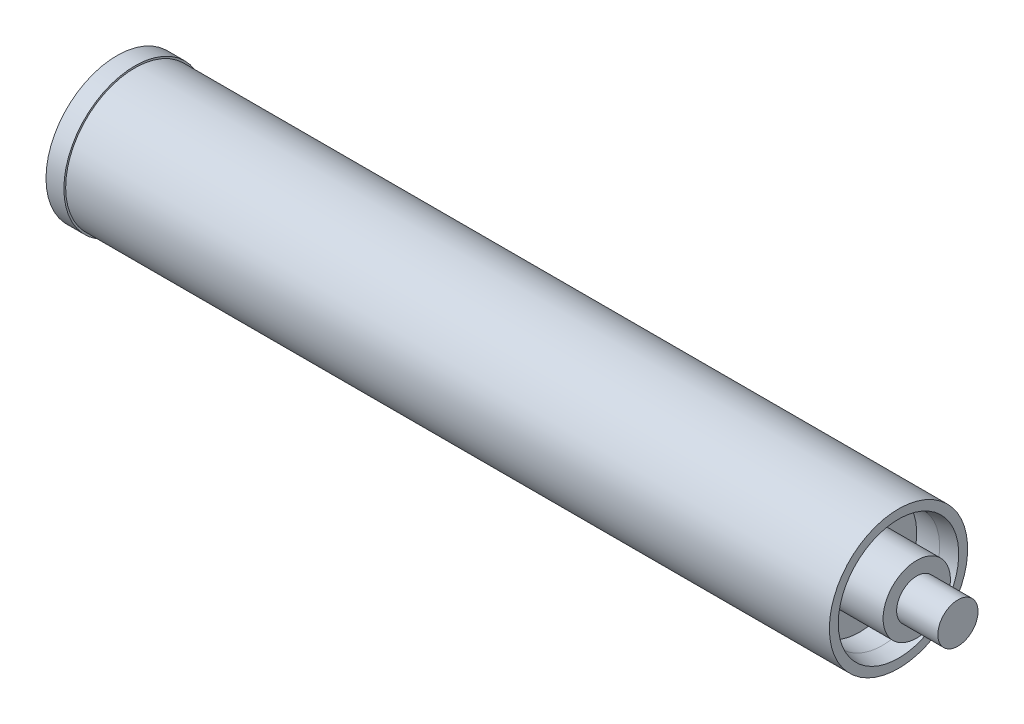
ISO-10303-21;
HEADER;
FILE_DESCRIPTION(('STEP AP214'),'2;1');
FILE_NAME('part.step','',(''),(''),'','','');
FILE_SCHEMA(('AUTOMOTIVE_DESIGN { 1 0 10303 214 1 1 1 1 }'));
ENDSEC;
DATA;
#1=APPLICATION_CONTEXT('core data for automotive mechanical design processes');
#2=APPLICATION_PROTOCOL_DEFINITION('international standard','automotive_design',2000,#1);
#3=PRODUCT_CONTEXT('',#1,'mechanical');
#4=PRODUCT('Part','Part','',(#3));
#5=PRODUCT_RELATED_PRODUCT_CATEGORY('part','',(#4));
#6=PRODUCT_DEFINITION_FORMATION('','',#4);
#7=PRODUCT_DEFINITION_CONTEXT('part definition',#1,'design');
#8=PRODUCT_DEFINITION('design','',#6,#7);
#9=PRODUCT_DEFINITION_SHAPE('','',#8);
#10=(LENGTH_UNIT() NAMED_UNIT(*) SI_UNIT(.MILLI.,.METRE.));
#11=(NAMED_UNIT(*) PLANE_ANGLE_UNIT() SI_UNIT($,.RADIAN.));
#12=(NAMED_UNIT(*) SI_UNIT($,.STERADIAN.) SOLID_ANGLE_UNIT());
#13=UNCERTAINTY_MEASURE_WITH_UNIT(LENGTH_MEASURE(1.E-05),#10,'distance_accuracy_value','');
#14=(GEOMETRIC_REPRESENTATION_CONTEXT(3) GLOBAL_UNCERTAINTY_ASSIGNED_CONTEXT((#13)) GLOBAL_UNIT_ASSIGNED_CONTEXT((#10,
#11,#12)) REPRESENTATION_CONTEXT('',''));
#15=CARTESIAN_POINT('',(0.,0.,0.));
#16=DIRECTION('',(0.,0.,1.));
#17=DIRECTION('',(1.,0.,0.));
#18=AXIS2_PLACEMENT_3D('',#15,#16,#17);
#19=CARTESIAN_POINT('',(36.5674158404261,35.6891384392189,0.));
#20=DIRECTION('',(1.,0.,0.));
#21=DIRECTION('',(0.,0.,-1.));
#22=AXIS2_PLACEMENT_3D('',#19,#20,#21);
#23=PLANE('',#22);
#24=CARTESIAN_POINT('',(36.5674158404261,0.,0.));
#25=DIRECTION('',(-1.,0.,0.));
#26=DIRECTION('',(0.,0.,1.));
#27=AXIS2_PLACEMENT_3D('',#24,#25,#26);
#28=CIRCLE('',#27,26.);
#29=CARTESIAN_POINT('',(36.5674158404261,0.,26.));
#30=VERTEX_POINT('',#29);
#31=EDGE_CURVE('E106',#30,#30,#28,.T.);
#32=ORIENTED_EDGE('',*,*,#31,.F.);
#33=EDGE_LOOP('',(#32));
#34=FACE_BOUND('',#33,.T.);
#35=CARTESIAN_POINT('',(36.5674158404261,0.,0.));
#36=DIRECTION('',(-1.,0.,0.));
#37=DIRECTION('',(0.,0.,1.));
#38=AXIS2_PLACEMENT_3D('',#35,#36,#37);
#39=CIRCLE('',#38,35.6891384392189);
#40=CARTESIAN_POINT('',(36.5674158404261,0.,35.6891384392189));
#41=VERTEX_POINT('',#40);
#42=EDGE_CURVE('E10',#41,#41,#39,.T.);
#43=ORIENTED_EDGE('',*,*,#42,.T.);
#44=EDGE_LOOP('',(#43));
#45=FACE_BOUND('',#44,.T.);
#46=ADVANCED_FACE('F37',(#34,#45),#23,.F.);
#47=CARTESIAN_POINT('',(0.,0.,0.));
#48=DIRECTION('',(-1.,0.,0.));
#49=DIRECTION('',(0.,0.,1.));
#50=AXIS2_PLACEMENT_3D('',#47,#48,#49);
#51=CYLINDRICAL_SURFACE('',#50,35.6891384392189);
#52=ORIENTED_EDGE('',*,*,#42,.F.);
#53=EDGE_LOOP('',(#52));
#54=FACE_BOUND('',#53,.T.);
#55=CARTESIAN_POINT('',(25.4,0.,0.));
#56=DIRECTION('',(-1.,0.,0.));
#57=DIRECTION('',(0.,0.,1.));
#58=AXIS2_PLACEMENT_3D('',#55,#56,#57);
#59=CIRCLE('',#58,35.6891384392189);
#60=CARTESIAN_POINT('',(25.4,0.,35.6891384392189));
#61=VERTEX_POINT('',#60);
#62=EDGE_CURVE('E44',#61,#61,#59,.T.);
#63=ORIENTED_EDGE('',*,*,#62,.T.);
#64=EDGE_LOOP('',(#63));
#65=FACE_BOUND('',#64,.T.);
#66=ADVANCED_FACE('F158',(#54,#65),#51,.F.);
#67=CARTESIAN_POINT('',(12.7,0.,0.));
#68=DIRECTION('',(-1.,0.,0.));
#69=DIRECTION('',(0.,0.,1.));
#70=AXIS2_PLACEMENT_3D('',#67,#68,#69);
#71=CONICAL_SURFACE('',#70,38.2095,0.195908259244877);
#72=ORIENTED_EDGE('',*,*,#62,.F.);
#73=EDGE_LOOP('',(#72));
#74=FACE_BOUND('',#73,.T.);
#75=CARTESIAN_POINT('',(12.7,0.,0.));
#76=DIRECTION('',(-1.,0.,0.));
#77=DIRECTION('',(0.,0.,1.));
#78=AXIS2_PLACEMENT_3D('',#75,#76,#77);
#79=CIRCLE('',#78,38.2095);
#80=CARTESIAN_POINT('',(12.7,0.,38.2095));
#81=VERTEX_POINT('',#80);
#82=EDGE_CURVE('E51',#81,#81,#79,.T.);
#83=ORIENTED_EDGE('',*,*,#82,.T.);
#84=EDGE_LOOP('',(#83));
#85=FACE_BOUND('',#84,.T.);
#86=ADVANCED_FACE('F163',(#74,#85),#71,.F.);
#87=CARTESIAN_POINT('',(12.7,50.419,0.));
#88=DIRECTION('',(1.,0.,0.));
#89=DIRECTION('',(0.,0.,-1.));
#90=AXIS2_PLACEMENT_3D('',#87,#88,#89);
#91=PLANE('',#90);
#92=ORIENTED_EDGE('',*,*,#82,.F.);
#93=EDGE_LOOP('',(#92));
#94=FACE_BOUND('',#93,.T.);
#95=CARTESIAN_POINT('',(12.7,0.,0.));
#96=DIRECTION('',(-1.,0.,0.));
#97=DIRECTION('',(0.,0.,1.));
#98=AXIS2_PLACEMENT_3D('',#95,#96,#97);
#99=CIRCLE('',#98,50.419);
#100=CARTESIAN_POINT('',(12.7,0.,50.419));
#101=VERTEX_POINT('',#100);
#102=EDGE_CURVE('E58',#101,#101,#99,.T.);
#103=ORIENTED_EDGE('',*,*,#102,.T.);
#104=EDGE_LOOP('',(#103));
#105=FACE_BOUND('',#104,.T.);
#106=ADVANCED_FACE('F169',(#94,#105),#91,.F.);
#107=CARTESIAN_POINT('',(0.,0.,0.));
#108=DIRECTION('',(-1.,0.,0.));
#109=DIRECTION('',(0.,0.,1.));
#110=AXIS2_PLACEMENT_3D('',#107,#108,#109);
#111=CYLINDRICAL_SURFACE('',#110,50.419);
#112=CARTESIAN_POINT('',(25.4,0.,0.));
#113=DIRECTION('',(-1.,0.,0.));
#114=DIRECTION('',(0.,0.,1.));
#115=AXIS2_PLACEMENT_3D('',#112,#113,#114);
#116=CIRCLE('',#115,50.419);
#117=CARTESIAN_POINT('',(25.4,0.,50.419));
#118=VERTEX_POINT('',#117);
#119=EDGE_CURVE('E64',#118,#118,#116,.T.);
#120=ORIENTED_EDGE('',*,*,#119,.T.);
#121=EDGE_LOOP('',(#120));
#122=FACE_BOUND('',#121,.T.);
#123=ORIENTED_EDGE('',*,*,#102,.F.);
#124=EDGE_LOOP('',(#123));
#125=FACE_BOUND('',#124,.T.);
#126=ADVANCED_FACE('F175',(#122,#125),#111,.T.);
#127=CARTESIAN_POINT('',(25.4,50.419,0.));
#128=DIRECTION('',(1.,0.,0.));
#129=DIRECTION('',(0.,0.,-1.));
#130=AXIS2_PLACEMENT_3D('',#127,#128,#129);
#131=PLANE('',#130);
#132=CARTESIAN_POINT('',(25.4,0.,0.));
#133=DIRECTION('',(-1.,0.,0.));
#134=DIRECTION('',(0.,0.,1.));
#135=AXIS2_PLACEMENT_3D('',#132,#133,#134);
#136=CIRCLE('',#135,49.149);
#137=CARTESIAN_POINT('',(25.4,0.,49.149));
#138=VERTEX_POINT('',#137);
#139=EDGE_CURVE('E68',#138,#138,#136,.T.);
#140=ORIENTED_EDGE('',*,*,#139,.T.);
#141=EDGE_LOOP('',(#140));
#142=FACE_BOUND('',#141,.T.);
#143=ORIENTED_EDGE('',*,*,#119,.F.);
#144=EDGE_LOOP('',(#143));
#145=FACE_BOUND('',#144,.T.);
#146=ADVANCED_FACE('F179',(#142,#145),#131,.T.);
#147=CARTESIAN_POINT('',(0.,0.,0.));
#148=DIRECTION('',(-1.,0.,0.));
#149=DIRECTION('',(0.,0.,1.));
#150=AXIS2_PLACEMENT_3D('',#147,#148,#149);
#151=CYLINDRICAL_SURFACE('',#150,49.149);
#152=CARTESIAN_POINT('',(568.32,0.,0.));
#153=DIRECTION('',(-1.,0.,0.));
#154=DIRECTION('',(0.,0.,1.));
#155=AXIS2_PLACEMENT_3D('',#152,#153,#154);
#156=CIRCLE('',#155,49.149);
#157=CARTESIAN_POINT('',(568.32,0.,49.149));
#158=VERTEX_POINT('',#157);
#159=EDGE_CURVE('E71',#158,#158,#156,.T.);
#160=ORIENTED_EDGE('',*,*,#159,.T.);
#161=EDGE_LOOP('',(#160));
#162=FACE_BOUND('',#161,.T.);
#163=ORIENTED_EDGE('',*,*,#139,.F.);
#164=EDGE_LOOP('',(#163));
#165=FACE_BOUND('',#164,.T.);
#166=ADVANCED_FACE('F183',(#162,#165),#151,.T.);
#167=CARTESIAN_POINT('',(568.32,49.149,0.));
#168=DIRECTION('',(1.,0.,0.));
#169=DIRECTION('',(0.,0.,-1.));
#170=AXIS2_PLACEMENT_3D('',#167,#168,#169);
#171=PLANE('',#170);
#172=CARTESIAN_POINT('',(568.32,0.,0.));
#173=DIRECTION('',(-1.,0.,0.));
#174=DIRECTION('',(0.,0.,1.));
#175=AXIS2_PLACEMENT_3D('',#172,#173,#174);
#176=CIRCLE('',#175,42.8201877110918);
#177=CARTESIAN_POINT('',(568.32,0.,42.8201877110918));
#178=VERTEX_POINT('',#177);
#179=EDGE_CURVE('E74',#178,#178,#176,.T.);
#180=ORIENTED_EDGE('',*,*,#179,.T.);
#181=EDGE_LOOP('',(#180));
#182=FACE_BOUND('',#181,.T.);
#183=ORIENTED_EDGE('',*,*,#159,.F.);
#184=EDGE_LOOP('',(#183));
#185=FACE_BOUND('',#184,.T.);
#186=ADVANCED_FACE('F187',(#182,#185),#171,.T.);
#187=CARTESIAN_POINT('',(568.32,0.,0.));
#188=DIRECTION('',(1.,0.,0.));
#189=DIRECTION('',(0.,0.,-1.));
#190=AXIS2_PLACEMENT_3D('',#187,#188,#189);
#191=CONICAL_SURFACE('',#190,42.8201877110918,0.195908259244877);
#192=CARTESIAN_POINT('',(556.997148349975,0.,0.));
#193=DIRECTION('',(-1.,0.,0.));
#194=DIRECTION('',(0.,0.,1.));
#195=AXIS2_PLACEMENT_3D('',#192,#193,#194);
#196=CIRCLE('',#195,40.573126289269);
#197=CARTESIAN_POINT('',(556.997148349975,0.,40.573126289269));
#198=VERTEX_POINT('',#197);
#199=EDGE_CURVE('E78',#198,#198,#196,.T.);
#200=ORIENTED_EDGE('',*,*,#199,.T.);
#201=EDGE_LOOP('',(#200));
#202=FACE_BOUND('',#201,.T.);
#203=ORIENTED_EDGE('',*,*,#179,.F.);
#204=EDGE_LOOP('',(#203));
#205=FACE_BOUND('',#204,.T.);
#206=ADVANCED_FACE('F191',(#202,#205),#191,.F.);
#207=CARTESIAN_POINT('',(0.,0.,0.));
#208=DIRECTION('',(-1.,0.,0.));
#209=DIRECTION('',(0.,0.,1.));
#210=AXIS2_PLACEMENT_3D('',#207,#208,#209);
#211=CYLINDRICAL_SURFACE('',#210,40.573126289269);
#212=CARTESIAN_POINT('',(540.71,0.,0.));
#213=DIRECTION('',(-1.,0.,0.));
#214=DIRECTION('',(0.,0.,1.));
#215=AXIS2_PLACEMENT_3D('',#212,#213,#214);
#216=CIRCLE('',#215,40.573126289269);
#217=CARTESIAN_POINT('',(540.71,0.,40.573126289269));
#218=VERTEX_POINT('',#217);
#219=EDGE_CURVE('E82',#218,#218,#216,.T.);
#220=ORIENTED_EDGE('',*,*,#219,.T.);
#221=EDGE_LOOP('',(#220));
#222=FACE_BOUND('',#221,.T.);
#223=ORIENTED_EDGE('',*,*,#199,.F.);
#224=EDGE_LOOP('',(#223));
#225=FACE_BOUND('',#224,.T.);
#226=ADVANCED_FACE('F195',(#222,#225),#211,.F.);
#227=CARTESIAN_POINT('',(540.71,40.573126289269,0.));
#228=DIRECTION('',(1.,0.,0.));
#229=DIRECTION('',(0.,0.,-1.));
#230=AXIS2_PLACEMENT_3D('',#227,#228,#229);
#231=PLANE('',#230);
#232=CARTESIAN_POINT('',(540.71,0.,0.));
#233=DIRECTION('',(-1.,0.,0.));
#234=DIRECTION('',(0.,0.,1.));
#235=AXIS2_PLACEMENT_3D('',#232,#233,#234);
#236=CIRCLE('',#235,23.9395);
#237=CARTESIAN_POINT('',(540.71,0.,23.9395));
#238=VERTEX_POINT('',#237);
#239=EDGE_CURVE('E86',#238,#238,#236,.T.);
#240=ORIENTED_EDGE('',*,*,#239,.T.);
#241=EDGE_LOOP('',(#240));
#242=FACE_BOUND('',#241,.T.);
#243=ORIENTED_EDGE('',*,*,#219,.F.);
#244=EDGE_LOOP('',(#243));
#245=FACE_BOUND('',#244,.T.);
#246=ADVANCED_FACE('F199',(#242,#245),#231,.T.);
#247=CARTESIAN_POINT('',(0.,0.,0.));
#248=DIRECTION('',(-1.,0.,0.));
#249=DIRECTION('',(0.,0.,1.));
#250=AXIS2_PLACEMENT_3D('',#247,#248,#249);
#251=CYLINDRICAL_SURFACE('',#250,23.9395);
#252=CARTESIAN_POINT('',(581.28,0.,0.));
#253=DIRECTION('',(-1.,0.,0.));
#254=DIRECTION('',(0.,0.,1.));
#255=AXIS2_PLACEMENT_3D('',#252,#253,#254);
#256=CIRCLE('',#255,23.9395);
#257=CARTESIAN_POINT('',(581.28,0.,23.9395));
#258=VERTEX_POINT('',#257);
#259=EDGE_CURVE('E90',#258,#258,#256,.T.);
#260=ORIENTED_EDGE('',*,*,#259,.T.);
#261=EDGE_LOOP('',(#260));
#262=FACE_BOUND('',#261,.T.);
#263=ORIENTED_EDGE('',*,*,#239,.F.);
#264=EDGE_LOOP('',(#263));
#265=FACE_BOUND('',#264,.T.);
#266=ADVANCED_FACE('F203',(#262,#265),#251,.T.);
#267=CARTESIAN_POINT('',(581.28,23.9395,0.));
#268=DIRECTION('',(1.,0.,0.));
#269=DIRECTION('',(0.,0.,-1.));
#270=AXIS2_PLACEMENT_3D('',#267,#268,#269);
#271=PLANE('',#270);
#272=CARTESIAN_POINT('',(581.28,0.,0.));
#273=DIRECTION('',(-1.,0.,0.));
#274=DIRECTION('',(0.,0.,1.));
#275=AXIS2_PLACEMENT_3D('',#272,#273,#274);
#276=CIRCLE('',#275,14.2875);
#277=CARTESIAN_POINT('',(581.28,0.,14.2875));
#278=VERTEX_POINT('',#277);
#279=EDGE_CURVE('E94',#278,#278,#276,.T.);
#280=ORIENTED_EDGE('',*,*,#279,.T.);
#281=EDGE_LOOP('',(#280));
#282=FACE_BOUND('',#281,.T.);
#283=ORIENTED_EDGE('',*,*,#259,.F.);
#284=EDGE_LOOP('',(#283));
#285=FACE_BOUND('',#284,.T.);
#286=ADVANCED_FACE('F207',(#282,#285),#271,.T.);
#287=CARTESIAN_POINT('',(0.,0.,0.));
#288=DIRECTION('',(-1.,0.,0.));
#289=DIRECTION('',(0.,0.,1.));
#290=AXIS2_PLACEMENT_3D('',#287,#288,#289);
#291=CYLINDRICAL_SURFACE('',#290,14.2875);
#292=CARTESIAN_POINT('',(610.57,0.,0.));
#293=DIRECTION('',(-1.,0.,0.));
#294=DIRECTION('',(0.,0.,1.));
#295=AXIS2_PLACEMENT_3D('',#292,#293,#294);
#296=CIRCLE('',#295,14.2875);
#297=CARTESIAN_POINT('',(610.57,0.,14.2875));
#298=VERTEX_POINT('',#297);
#299=EDGE_CURVE('E98',#298,#298,#296,.T.);
#300=ORIENTED_EDGE('',*,*,#299,.T.);
#301=EDGE_LOOP('',(#300));
#302=FACE_BOUND('',#301,.T.);
#303=ORIENTED_EDGE('',*,*,#279,.F.);
#304=EDGE_LOOP('',(#303));
#305=FACE_BOUND('',#304,.T.);
#306=ADVANCED_FACE('F211',(#302,#305),#291,.T.);
#307=CARTESIAN_POINT('',(610.57,0.,0.));
#308=DIRECTION('',(-1.,0.,0.));
#309=DIRECTION('',(0.,0.,1.));
#310=AXIS2_PLACEMENT_3D('',#307,#308,#309);
#311=PLANE('',#310);
#312=ORIENTED_EDGE('',*,*,#299,.F.);
#313=EDGE_LOOP('',(#312));
#314=FACE_BOUND('',#313,.T.);
#315=ADVANCED_FACE('F143',(#314),#311,.F.);
#316=CARTESIAN_POINT('',(0.,26.,0.));
#317=DIRECTION('',(1.,0.,0.));
#318=DIRECTION('',(0.,0.,-1.));
#319=AXIS2_PLACEMENT_3D('',#316,#317,#318);
#320=PLANE('',#319);
#321=CARTESIAN_POINT('',(0.,0.,0.));
#322=DIRECTION('',(-1.,0.,0.));
#323=DIRECTION('',(0.,0.,1.));
#324=AXIS2_PLACEMENT_3D('',#321,#322,#323);
#325=CIRCLE('',#324,20.);
#326=CARTESIAN_POINT('',(0.,0.,20.));
#327=VERTEX_POINT('',#326);
#328=EDGE_CURVE('E131',#327,#327,#325,.T.);
#329=ORIENTED_EDGE('',*,*,#328,.F.);
#330=EDGE_LOOP('',(#329));
#331=FACE_BOUND('',#330,.T.);
#332=CARTESIAN_POINT('',(0.,0.,0.));
#333=DIRECTION('',(-1.,0.,0.));
#334=DIRECTION('',(0.,0.,1.));
#335=AXIS2_PLACEMENT_3D('',#332,#333,#334);
#336=CIRCLE('',#335,26.);
#337=CARTESIAN_POINT('',(0.,0.,26.));
#338=VERTEX_POINT('',#337);
#339=EDGE_CURVE('E102',#338,#338,#336,.T.);
#340=ORIENTED_EDGE('',*,*,#339,.T.);
#341=EDGE_LOOP('',(#340));
#342=FACE_BOUND('',#341,.T.);
#343=ADVANCED_FACE('F139',(#331,#342),#320,.F.);
#344=CARTESIAN_POINT('',(0.,0.,0.));
#345=DIRECTION('',(-1.,0.,0.));
#346=DIRECTION('',(0.,0.,1.));
#347=AXIS2_PLACEMENT_3D('',#344,#345,#346);
#348=CYLINDRICAL_SURFACE('',#347,26.);
#349=ORIENTED_EDGE('',*,*,#31,.T.);
#350=EDGE_LOOP('',(#349));
#351=FACE_BOUND('',#350,.T.);
#352=ORIENTED_EDGE('',*,*,#339,.F.);
#353=EDGE_LOOP('',(#352));
#354=FACE_BOUND('',#353,.T.);
#355=ADVANCED_FACE('F142',(#351,#354),#348,.T.);
#356=CARTESIAN_POINT('',(540.71,0.,0.));
#357=DIRECTION('',(-1.,0.,0.));
#358=DIRECTION('',(0.,0.,1.));
#359=AXIS2_PLACEMENT_3D('',#356,#357,#358);
#360=PLANE('',#359);
#361=CARTESIAN_POINT('',(540.71,0.,0.));
#362=DIRECTION('',(-1.,0.,0.));
#363=DIRECTION('',(0.,0.,1.));
#364=AXIS2_PLACEMENT_3D('',#361,#362,#363);
#365=CIRCLE('',#364,12.9577572212731);
#366=CARTESIAN_POINT('',(540.71,0.,12.9577572212731));
#367=VERTEX_POINT('',#366);
#368=EDGE_CURVE('E109',#367,#367,#365,.T.);
#369=ORIENTED_EDGE('',*,*,#368,.T.);
#370=EDGE_LOOP('',(#369));
#371=FACE_BOUND('',#370,.T.);
#372=ADVANCED_FACE('F148',(#371),#360,.T.);
#373=CARTESIAN_POINT('',(0.,0.,0.));
#374=DIRECTION('',(-1.,0.,0.));
#375=DIRECTION('',(0.,0.,1.));
#376=AXIS2_PLACEMENT_3D('',#373,#374,#375);
#377=CYLINDRICAL_SURFACE('',#376,12.9577572212731);
#378=CARTESIAN_POINT('',(381.061065958821,0.,0.));
#379=DIRECTION('',(-1.,0.,0.));
#380=DIRECTION('',(0.,0.,1.));
#381=AXIS2_PLACEMENT_3D('',#378,#379,#380);
#382=CIRCLE('',#381,12.9577572212731);
#383=CARTESIAN_POINT('',(381.061065958821,0.,12.9577572212731));
#384=VERTEX_POINT('',#383);
#385=EDGE_CURVE('E113',#384,#384,#382,.T.);
#386=ORIENTED_EDGE('',*,*,#385,.T.);
#387=EDGE_LOOP('',(#386));
#388=FACE_BOUND('',#387,.T.);
#389=ORIENTED_EDGE('',*,*,#368,.F.);
#390=EDGE_LOOP('',(#389));
#391=FACE_BOUND('',#390,.T.);
#392=ADVANCED_FACE('F154',(#388,#391),#377,.F.);
#393=CARTESIAN_POINT('',(381.061065958821,12.9577572212731,0.));
#394=DIRECTION('',(-1.,0.,0.));
#395=DIRECTION('',(0.,0.,1.));
#396=AXIS2_PLACEMENT_3D('',#393,#394,#395);
#397=PLANE('',#396);
#398=CARTESIAN_POINT('',(381.061065958821,0.,0.));
#399=DIRECTION('',(-1.,0.,0.));
#400=DIRECTION('',(0.,0.,1.));
#401=AXIS2_PLACEMENT_3D('',#398,#399,#400);
#402=CIRCLE('',#401,44.271024872523);
#403=CARTESIAN_POINT('',(381.061065958821,0.,44.271024872523));
#404=VERTEX_POINT('',#403);
#405=EDGE_CURVE('E117',#404,#404,#402,.T.);
#406=ORIENTED_EDGE('',*,*,#405,.T.);
#407=EDGE_LOOP('',(#406));
#408=FACE_BOUND('',#407,.T.);
#409=ORIENTED_EDGE('',*,*,#385,.F.);
#410=EDGE_LOOP('',(#409));
#411=FACE_BOUND('',#410,.T.);
#412=ADVANCED_FACE('F358',(#408,#411),#397,.T.);
#413=CARTESIAN_POINT('',(0.,0.,0.));
#414=DIRECTION('',(-1.,0.,0.));
#415=DIRECTION('',(0.,0.,1.));
#416=AXIS2_PLACEMENT_3D('',#413,#414,#415);
#417=CYLINDRICAL_SURFACE('',#416,44.271024872523);
#418=CARTESIAN_POINT('',(65.8718789343533,0.,0.));
#419=DIRECTION('',(-1.,0.,0.));
#420=DIRECTION('',(0.,0.,1.));
#421=AXIS2_PLACEMENT_3D('',#418,#419,#420);
#422=CIRCLE('',#421,44.271024872523);
#423=CARTESIAN_POINT('',(65.8718789343533,0.,-44.271024872523));
#424=VERTEX_POINT('',#423);
#425=EDGE_CURVE('E120',#424,#424,#422,.T.);
#426=ORIENTED_EDGE('',*,*,#425,.T.);
#427=EDGE_LOOP('',(#426));
#428=FACE_BOUND('',#427,.T.);
#429=ORIENTED_EDGE('',*,*,#405,.F.);
#430=EDGE_LOOP('',(#429));
#431=FACE_BOUND('',#430,.T.);
#432=ADVANCED_FACE('F367',(#428,#431),#417,.F.);
#433=CARTESIAN_POINT('',(65.8718789343533,0.,0.));
#434=DIRECTION('',(1.,0.,0.));
#435=DIRECTION('',(0.,0.,-1.));
#436=AXIS2_PLACEMENT_3D('',#433,#434,#435);
#437=CONICAL_SURFACE('',#436,44.271024872523,0.755513024128266);
#438=CARTESIAN_POINT('',(34.0830061399178,0.,0.));
#439=DIRECTION('',(-1.,0.,0.));
#440=DIRECTION('',(0.,0.,1.));
#441=AXIS2_PLACEMENT_3D('',#438,#439,#440);
#442=CIRCLE('',#441,14.3275804068006);
#443=CARTESIAN_POINT('',(34.0830061399178,0.,-14.3275804068006));
#444=VERTEX_POINT('',#443);
#445=EDGE_CURVE('E124',#444,#444,#442,.T.);
#446=CARTESIAN_POINT('',(34.0830061399178,0.,-14.3275804068006));
#447=CARTESIAN_POINT('',(34.4141402315265,0.,-14.6394912866519));
#448=CARTESIAN_POINT('',(34.7452743231352,0.,-14.9514021665031));
#449=CARTESIAN_POINT('',(35.4075425063526,0.,-15.5752239262057));
#450=CARTESIAN_POINT('',(35.7386765979613,0.,-15.887134806057));
#451=CARTESIAN_POINT('',(36.4009447811787,0.,-16.5109565657595));
#452=CARTESIAN_POINT('',(36.7320788727874,0.,-16.8228674456108));
#453=CARTESIAN_POINT('',(37.3943470560048,0.,-17.4466892053133));
#454=CARTESIAN_POINT('',(37.7254811476135,0.,-17.7586000851646));
#455=CARTESIAN_POINT('',(38.3877493308309,0.,-18.3824218448672));
#456=CARTESIAN_POINT('',(38.7188834224396,0.,-18.6943327247184));
#457=CARTESIAN_POINT('',(39.381151605657,0.,-19.318154484421));
#458=CARTESIAN_POINT('',(39.7122856972657,0.,-19.6300653642723));
#459=CARTESIAN_POINT('',(40.3745538804831,0.,-20.2538871239748));
#460=CARTESIAN_POINT('',(40.7056879720918,0.,-20.5657980038261));
#461=CARTESIAN_POINT('',(41.3679561553093,0.,-21.1896197635286));
#462=CARTESIAN_POINT('',(41.699090246918,0.,-21.5015306433799));
#463=CARTESIAN_POINT('',(42.3613584301354,0.,-22.1253524030825));
#464=CARTESIAN_POINT('',(42.6924925217441,0.,-22.4372632829337));
#465=CARTESIAN_POINT('',(43.3547607049615,0.,-23.0610850426363));
#466=CARTESIAN_POINT('',(43.6858947965702,0.,-23.3729959224876));
#467=CARTESIAN_POINT('',(44.3481629797876,0.,-23.9968176821901));
#468=CARTESIAN_POINT('',(44.6792970713963,0.,-24.3087285620414));
#469=CARTESIAN_POINT('',(45.3415652546137,0.,-24.9325503217439));
#470=CARTESIAN_POINT('',(45.6726993462224,0.,-25.2444612015952));
#471=CARTESIAN_POINT('',(46.3349675294398,0.,-25.8682829612978));
#472=CARTESIAN_POINT('',(46.6661016210485,0.,-26.180193841149));
#473=CARTESIAN_POINT('',(47.3283698042659,0.,-26.8040156008516));
#474=CARTESIAN_POINT('',(47.6595038958746,0.,-27.1159264807029));
#475=CARTESIAN_POINT('',(48.321772079092,0.,-27.7397482404054));
#476=CARTESIAN_POINT('',(48.6529061707007,0.,-28.0516591202567));
#477=CARTESIAN_POINT('',(49.3151743539181,0.,-28.6754808799592));
#478=CARTESIAN_POINT('',(49.6463084455268,0.,-28.9873917598105));
#479=CARTESIAN_POINT('',(50.3085766287442,0.,-29.6112135195131));
#480=CARTESIAN_POINT('',(50.6397107203529,0.,-29.9231243993643));
#481=CARTESIAN_POINT('',(51.3019789035703,0.,-30.5469461590669));
#482=CARTESIAN_POINT('',(51.633112995179,0.,-30.8588570389182));
#483=CARTESIAN_POINT('',(52.2953811783965,0.,-31.4826787986207));
#484=CARTESIAN_POINT('',(52.6265152700052,0.,-31.794589678472));
#485=CARTESIAN_POINT('',(53.2887834532226,0.,-32.4184114381745));
#486=CARTESIAN_POINT('',(53.6199175448313,0.,-32.7303223180258));
#487=CARTESIAN_POINT('',(54.2821857280487,0.,-33.3541440777284));
#488=CARTESIAN_POINT('',(54.6133198196574,0.,-33.6660549575796));
#489=CARTESIAN_POINT('',(55.2755880028748,0.,-34.2898767172822));
#490=CARTESIAN_POINT('',(55.6067220944835,0.,-34.6017875971335));
#491=CARTESIAN_POINT('',(56.2689902777009,0.,-35.225609356836));
#492=CARTESIAN_POINT('',(56.6001243693096,0.,-35.5375202366873));
#493=CARTESIAN_POINT('',(57.262392552527,0.,-36.1613419963898));
#494=CARTESIAN_POINT('',(57.5935266441357,0.,-36.4732528762411));
#495=CARTESIAN_POINT('',(58.2557948273531,0.,-37.0970746359437));
#496=CARTESIAN_POINT('',(58.5869289189618,0.,-37.4089855157949));
#497=CARTESIAN_POINT('',(59.2491971021792,0.,-38.0328072754975));
#498=CARTESIAN_POINT('',(59.5803311937879,0.,-38.3447181553488));
#499=CARTESIAN_POINT('',(60.2425993770053,0.,-38.9685399150513));
#500=CARTESIAN_POINT('',(60.573733468614,0.,-39.2804507949026));
#501=CARTESIAN_POINT('',(61.2360016518314,0.,-39.9042725546051));
#502=CARTESIAN_POINT('',(61.5671357434401,0.,-40.2161834344564));
#503=CARTESIAN_POINT('',(62.2294039266575,0.,-40.840005194159));
#504=CARTESIAN_POINT('',(62.5605380182663,0.,-41.1519160740102));
#505=CARTESIAN_POINT('',(63.2228062014837,0.,-41.7757378337128));
#506=CARTESIAN_POINT('',(63.5539402930924,0.,-42.0876487135641));
#507=CARTESIAN_POINT('',(64.2162084763098,0.,-42.7114704732666));
#508=CARTESIAN_POINT('',(64.5473425679185,0.,-43.0233813531179));
#509=CARTESIAN_POINT('',(65.2096107511359,0.,-43.6472031128204));
#510=CARTESIAN_POINT('',(65.5407448427446,0.,-43.9591139926717));
#511=CARTESIAN_POINT('',(65.8718789343533,0.,-44.271024872523));
#512=B_SPLINE_CURVE_WITH_KNOTS('',3,(#446,#447,#448,#449,#450,#451,#452,#453,#454,#455,#456,
#457,#458,#459,#460,#461,#462,#463,#464,#465,#466,#467,#468,#469,#470,#471,#472,#473,#474,#475,
#476,#477,#478,#479,#480,#481,#482,#483,#484,#485,#486,#487,#488,#489,#490,#491,#492,#493,#494,
#495,#496,#497,#498,#499,#500,#501,#502,#503,#504,#505,#506,#507,#508,#509,#510,#511),
.UNSPECIFIED.,.F.,.F.,(4,2,2,2,2,2,2,2,2,2,2,2,2,2,2,2,2,2,2,2,2,2,2,2,2,2,2,2,2,2,2,2,4),(0.,
1.36471376206004,2.72942752412007,4.09414128618011,5.45885504824014,6.82356881030018,
8.18828257236022,9.55299633442025,10.9177100964803,12.2824238585403,13.6471376206004,
15.0118513826604,16.3765651447204,17.7412789067805,19.1059926688405,20.4707064309005,
21.8354201929606,23.2001339550206,24.5648477170806,25.9295614791407,27.2942752412007,
28.6589890032608,30.0237027653208,31.3884165273808,32.7531302894409,34.1178440515009,
35.4825578135609,36.847271575621,38.211985337681,39.576699099741,40.9414128618011,
42.3061266238611,43.6708403859212),.UNSPECIFIED.);
#513=EDGE_CURVE('BSEAM376',#444,#424,#512,.T.);
#514=ORIENTED_EDGE('',*,*,#445,.T.);
#515=ORIENTED_EDGE('',*,*,#425,.F.);
#516=ORIENTED_EDGE('',*,*,#513,.T.);
#517=ORIENTED_EDGE('',*,*,#513,.F.);
#518=EDGE_LOOP('',(#514,#516,#515,#517));
#519=FACE_BOUND('',#518,.T.);
#520=ADVANCED_FACE('F376',(#519),#437,.F.);
#521=CARTESIAN_POINT('',(0.,0.,0.));
#522=DIRECTION('',(-1.,0.,0.));
#523=DIRECTION('',(0.,0.,1.));
#524=AXIS2_PLACEMENT_3D('',#521,#522,#523);
#525=CYLINDRICAL_SURFACE('',#524,14.3275804068006);
#526=CARTESIAN_POINT('',(19.0830061399178,0.,0.));
#527=DIRECTION('',(-1.,0.,0.));
#528=DIRECTION('',(0.,0.,1.));
#529=AXIS2_PLACEMENT_3D('',#526,#527,#528);
#530=CIRCLE('',#529,14.3275804068006);
#531=CARTESIAN_POINT('',(19.0830061399178,0.,14.3275804068006));
#532=VERTEX_POINT('',#531);
#533=EDGE_CURVE('E128',#532,#532,#530,.T.);
#534=ORIENTED_EDGE('',*,*,#533,.T.);
#535=EDGE_LOOP('',(#534));
#536=FACE_BOUND('',#535,.T.);
#537=ORIENTED_EDGE('',*,*,#445,.F.);
#538=EDGE_LOOP('',(#537));
#539=FACE_BOUND('',#538,.T.);
#540=ADVANCED_FACE('F385',(#536,#539),#525,.F.);
#541=CARTESIAN_POINT('',(19.0830061399178,0.,0.));
#542=DIRECTION('',(-1.,0.,0.));
#543=DIRECTION('',(0.,0.,1.));
#544=AXIS2_PLACEMENT_3D('',#541,#542,#543);
#545=CONICAL_SURFACE('',#544,14.3275804068006,0.288931761333724);
#546=ORIENTED_EDGE('',*,*,#328,.T.);
#547=EDGE_LOOP('',(#546));
#548=FACE_BOUND('',#547,.T.);
#549=ORIENTED_EDGE('',*,*,#533,.F.);
#550=EDGE_LOOP('',(#549));
#551=FACE_BOUND('',#550,.T.);
#552=ADVANCED_FACE('F136',(#548,#551),#545,.F.);
#553=CLOSED_SHELL('',(#46,#66,#86,#106,#126,#146,#166,#186,#206,#226,#246,#266,#286,#306,#315,
#343,#355,#372,#392,#412,#432,#520,#540,#552));
#554=MANIFOLD_SOLID_BREP('B2',#553);
#555=ADVANCED_BREP_SHAPE_REPRESENTATION('',(#18,#554),#14);
#556=SHAPE_DEFINITION_REPRESENTATION(#9,#555);
ENDSEC;
END-ISO-10303-21;
